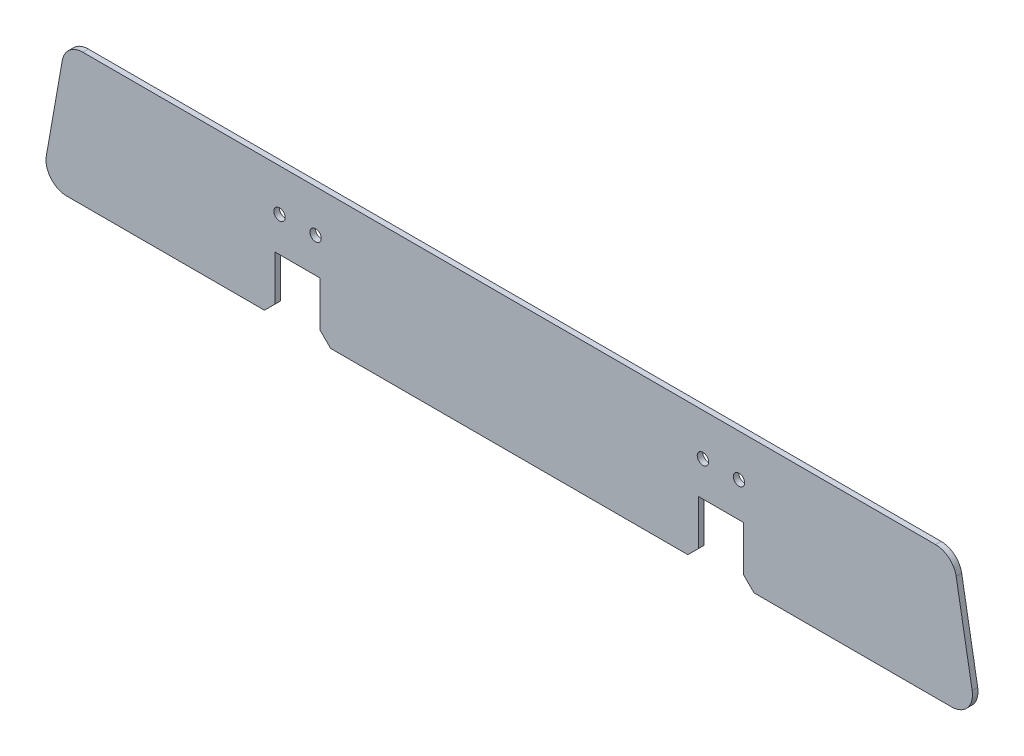
ISO-10303-21;
HEADER;
FILE_DESCRIPTION(('STEP AP214'),'2;1');
FILE_NAME('part.step','',(''),(''),'','','');
FILE_SCHEMA(('AUTOMOTIVE_DESIGN { 1 0 10303 214 1 1 1 1 }'));
ENDSEC;
DATA;
#1=APPLICATION_CONTEXT('core data for automotive mechanical design processes');
#2=APPLICATION_PROTOCOL_DEFINITION('international standard','automotive_design',2000,#1);
#3=PRODUCT_CONTEXT('',#1,'mechanical');
#4=PRODUCT('Part','Part','',(#3));
#5=PRODUCT_RELATED_PRODUCT_CATEGORY('part','',(#4));
#6=PRODUCT_DEFINITION_FORMATION('','',#4);
#7=PRODUCT_DEFINITION_CONTEXT('part definition',#1,'design');
#8=PRODUCT_DEFINITION('design','',#6,#7);
#9=PRODUCT_DEFINITION_SHAPE('','',#8);
#10=(LENGTH_UNIT() NAMED_UNIT(*) SI_UNIT(.MILLI.,.METRE.));
#11=(NAMED_UNIT(*) PLANE_ANGLE_UNIT() SI_UNIT($,.RADIAN.));
#12=(NAMED_UNIT(*) SI_UNIT($,.STERADIAN.) SOLID_ANGLE_UNIT());
#13=UNCERTAINTY_MEASURE_WITH_UNIT(LENGTH_MEASURE(1.E-05),#10,'distance_accuracy_value','');
#14=(GEOMETRIC_REPRESENTATION_CONTEXT(3) GLOBAL_UNCERTAINTY_ASSIGNED_CONTEXT((#13)) GLOBAL_UNIT_ASSIGNED_CONTEXT((#10,
#11,#12)) REPRESENTATION_CONTEXT('',''));
#15=CARTESIAN_POINT('',(0.,0.,0.));
#16=DIRECTION('',(0.,0.,1.));
#17=DIRECTION('',(1.,0.,0.));
#18=AXIS2_PLACEMENT_3D('',#15,#16,#17);
#19=CARTESIAN_POINT('',(-108.62,-38.1,3.175));
#20=DIRECTION('',(1.,0.,0.));
#21=DIRECTION('',(0.,1.,0.));
#22=AXIS2_PLACEMENT_3D('',#19,#20,#21);
#23=PLANE('',#22);
#24=DIRECTION('',(0.,1.,0.));
#25=VECTOR('',#24,1.);
#26=CARTESIAN_POINT('',(-108.62,0.,0.));
#27=LINE('',#26,#25);
#28=CARTESIAN_POINT('',(-108.62,-32.1000000000001,0.));
#29=VERTEX_POINT('',#28);
#30=CARTESIAN_POINT('',(-108.62,-6.10000000000003,0.));
#31=VERTEX_POINT('',#30);
#32=EDGE_CURVE('E276',#29,#31,#27,.T.);
#33=ORIENTED_EDGE('',*,*,#32,.F.);
#34=DIRECTION('',(0.,0.,-1.));
#35=VECTOR('',#34,1.);
#36=CARTESIAN_POINT('',(-108.62,-32.1000000000001,3.175));
#37=LINE('',#36,#35);
#38=CARTESIAN_POINT('',(-108.62,-32.1000000000001,3.175));
#39=VERTEX_POINT('',#38);
#40=EDGE_CURVE('E339',#29,#39,#37,.F.);
#41=ORIENTED_EDGE('',*,*,#40,.T.);
#42=DIRECTION('',(0.,1.,0.));
#43=VECTOR('',#42,1.);
#44=CARTESIAN_POINT('',(-108.62,-38.1,3.175));
#45=LINE('',#44,#43);
#46=CARTESIAN_POINT('',(-108.62,-6.10000000000003,3.175));
#47=VERTEX_POINT('',#46);
#48=EDGE_CURVE('E210',#39,#47,#45,.T.);
#49=ORIENTED_EDGE('',*,*,#48,.T.);
#50=DIRECTION('',(0.,0.,1.));
#51=VECTOR('',#50,1.);
#52=CARTESIAN_POINT('',(-108.62,-6.10000000000003,3.175));
#53=LINE('',#52,#51);
#54=EDGE_CURVE('E209',#31,#47,#53,.T.);
#55=ORIENTED_EDGE('',*,*,#54,.F.);
#56=EDGE_LOOP('',(#33,#41,#49,#55));
#57=FACE_BOUND('',#56,.T.);
#58=ADVANCED_FACE('F45',(#57),#23,.F.);
#59=CARTESIAN_POINT('',(255.,-38.1,3.175));
#60=DIRECTION('',(0.,-1.,0.));
#61=DIRECTION('',(1.,0.,0.));
#62=AXIS2_PLACEMENT_3D('',#59,#60,#61);
#63=PLANE('',#62);
#64=DIRECTION('',(1.,0.,0.));
#65=VECTOR('',#64,1.);
#66=CARTESIAN_POINT('',(255.,-38.1,3.175));
#67=LINE('',#66,#65);
#68=CARTESIAN_POINT('',(-102.62,-38.1,3.175));
#69=VERTEX_POINT('',#68);
#70=CARTESIAN_POINT('',(102.62,-38.1,3.175));
#71=VERTEX_POINT('',#70);
#72=EDGE_CURVE('E212',#69,#71,#67,.T.);
#73=ORIENTED_EDGE('',*,*,#72,.F.);
#74=DIRECTION('',(0.,0.,-1.));
#75=VECTOR('',#74,1.);
#76=CARTESIAN_POINT('',(-102.62,-38.1,3.175));
#77=LINE('',#76,#75);
#78=CARTESIAN_POINT('',(-102.62,-38.1,0.));
#79=VERTEX_POINT('',#78);
#80=EDGE_CURVE('E345',#69,#79,#77,.T.);
#81=ORIENTED_EDGE('',*,*,#80,.T.);
#82=DIRECTION('',(1.,0.,0.));
#83=VECTOR('',#82,1.);
#84=CARTESIAN_POINT('',(0.,-38.1,0.));
#85=LINE('',#84,#83);
#86=CARTESIAN_POINT('',(102.62,-38.1,0.));
#87=VERTEX_POINT('',#86);
#88=EDGE_CURVE('E274',#79,#87,#85,.T.);
#89=ORIENTED_EDGE('',*,*,#88,.T.);
#90=DIRECTION('',(0.,0.,1.));
#91=VECTOR('',#90,1.);
#92=CARTESIAN_POINT('',(102.62,-38.1,3.175));
#93=LINE('',#92,#91);
#94=EDGE_CURVE('E342',#87,#71,#93,.T.);
#95=ORIENTED_EDGE('',*,*,#94,.T.);
#96=EDGE_LOOP('',(#73,#81,#89,#95));
#97=FACE_BOUND('',#96,.T.);
#98=ADVANCED_FACE('F380',(#97),#63,.T.);
#99=CARTESIAN_POINT('',(108.62,-38.1,3.175));
#100=DIRECTION('',(-1.,0.,0.));
#101=DIRECTION('',(0.,-1.,0.));
#102=AXIS2_PLACEMENT_3D('',#99,#100,#101);
#103=PLANE('',#102);
#104=DIRECTION('',(0.,-1.,0.));
#105=VECTOR('',#104,1.);
#106=CARTESIAN_POINT('',(108.62,-38.1,3.175));
#107=LINE('',#106,#105);
#108=CARTESIAN_POINT('',(108.62,-6.10000000000003,3.175));
#109=VERTEX_POINT('',#108);
#110=CARTESIAN_POINT('',(108.62,-32.1,3.175));
#111=VERTEX_POINT('',#110);
#112=EDGE_CURVE('E218',#109,#111,#107,.T.);
#113=ORIENTED_EDGE('',*,*,#112,.T.);
#114=DIRECTION('',(0.,0.,1.));
#115=VECTOR('',#114,1.);
#116=CARTESIAN_POINT('',(108.62,-32.1,3.175));
#117=LINE('',#116,#115);
#118=CARTESIAN_POINT('',(108.62,-32.1,0.));
#119=VERTEX_POINT('',#118);
#120=EDGE_CURVE('E11',#111,#119,#117,.F.);
#121=ORIENTED_EDGE('',*,*,#120,.T.);
#122=DIRECTION('',(0.,1.,0.));
#123=VECTOR('',#122,1.);
#124=CARTESIAN_POINT('',(108.62,0.,0.));
#125=LINE('',#124,#123);
#126=CARTESIAN_POINT('',(108.62,-6.10000000000003,0.));
#127=VERTEX_POINT('',#126);
#128=EDGE_CURVE('E272',#127,#119,#125,.F.);
#129=ORIENTED_EDGE('',*,*,#128,.F.);
#130=DIRECTION('',(0.,0.,1.));
#131=VECTOR('',#130,1.);
#132=CARTESIAN_POINT('',(108.62,-6.10000000000003,3.175));
#133=LINE('',#132,#131);
#134=EDGE_CURVE('E281',#127,#109,#133,.T.);
#135=ORIENTED_EDGE('',*,*,#134,.T.);
#136=EDGE_LOOP('',(#113,#121,#129,#135));
#137=FACE_BOUND('',#136,.T.);
#138=ADVANCED_FACE('F374',(#137),#103,.F.);
#139=CARTESIAN_POINT('',(134.62,-6.10000000000002,3.175));
#140=DIRECTION('',(0.,1.,0.));
#141=DIRECTION('',(-1.,0.,0.));
#142=AXIS2_PLACEMENT_3D('',#139,#140,#141);
#143=PLANE('',#142);
#144=ORIENTED_EDGE('',*,*,#134,.F.);
#145=DIRECTION('',(1.,0.,0.));
#146=VECTOR('',#145,1.);
#147=CARTESIAN_POINT('',(0.,-6.10000000000002,0.));
#148=LINE('',#147,#146);
#149=CARTESIAN_POINT('',(134.62,-6.10000000000002,0.));
#150=VERTEX_POINT('',#149);
#151=EDGE_CURVE('E269',#150,#127,#148,.F.);
#152=ORIENTED_EDGE('',*,*,#151,.F.);
#153=DIRECTION('',(0.,0.,1.));
#154=VECTOR('',#153,1.);
#155=CARTESIAN_POINT('',(134.62,-6.10000000000002,3.175));
#156=LINE('',#155,#154);
#157=CARTESIAN_POINT('',(134.62,-6.10000000000002,3.175));
#158=VERTEX_POINT('',#157);
#159=EDGE_CURVE('E194',#150,#158,#156,.T.);
#160=ORIENTED_EDGE('',*,*,#159,.T.);
#161=DIRECTION('',(-1.,0.,0.));
#162=VECTOR('',#161,1.);
#163=CARTESIAN_POINT('',(134.62,-6.10000000000002,3.175));
#164=LINE('',#163,#162);
#165=EDGE_CURVE('E222',#158,#109,#164,.T.);
#166=ORIENTED_EDGE('',*,*,#165,.T.);
#167=EDGE_LOOP('',(#144,#152,#160,#166));
#168=FACE_BOUND('',#167,.T.);
#169=ADVANCED_FACE('F370',(#168),#143,.F.);
#170=CARTESIAN_POINT('',(134.62,-38.1,3.175));
#171=DIRECTION('',(1.,0.,0.));
#172=DIRECTION('',(0.,1.,0.));
#173=AXIS2_PLACEMENT_3D('',#170,#171,#172);
#174=PLANE('',#173);
#175=DIRECTION('',(0.,1.,0.));
#176=VECTOR('',#175,1.);
#177=CARTESIAN_POINT('',(134.62,0.,0.));
#178=LINE('',#177,#176);
#179=CARTESIAN_POINT('',(134.62,-32.1000000000001,0.));
#180=VERTEX_POINT('',#179);
#181=EDGE_CURVE('E267',#180,#150,#178,.T.);
#182=ORIENTED_EDGE('',*,*,#181,.F.);
#183=DIRECTION('',(0.,0.,-1.));
#184=VECTOR('',#183,1.);
#185=CARTESIAN_POINT('',(134.62,-32.1000000000001,3.175));
#186=LINE('',#185,#184);
#187=CARTESIAN_POINT('',(134.62,-32.1000000000001,3.175));
#188=VERTEX_POINT('',#187);
#189=EDGE_CURVE('E347',#180,#188,#186,.F.);
#190=ORIENTED_EDGE('',*,*,#189,.T.);
#191=DIRECTION('',(0.,1.,0.));
#192=VECTOR('',#191,1.);
#193=CARTESIAN_POINT('',(134.62,-38.1,3.175));
#194=LINE('',#193,#192);
#195=EDGE_CURVE('E225',#188,#158,#194,.T.);
#196=ORIENTED_EDGE('',*,*,#195,.T.);
#197=ORIENTED_EDGE('',*,*,#159,.F.);
#198=EDGE_LOOP('',(#182,#190,#196,#197));
#199=FACE_BOUND('',#198,.T.);
#200=ADVANCED_FACE('F365',(#199),#174,.F.);
#201=CARTESIAN_POINT('',(140.62,-38.1,3.175));
#202=VERTEX_POINT('',#201);
#203=CARTESIAN_POINT('',(254.135072818855,-38.1,3.175));
#204=VERTEX_POINT('',#203);
#205=EDGE_CURVE('E219',#202,#204,#67,.T.);
#206=ORIENTED_EDGE('',*,*,#205,.F.);
#207=DIRECTION('',(0.,0.,-1.));
#208=VECTOR('',#207,1.);
#209=CARTESIAN_POINT('',(140.62,-38.1,3.175));
#210=LINE('',#209,#208);
#211=CARTESIAN_POINT('',(140.62,-38.1,0.));
#212=VERTEX_POINT('',#211);
#213=EDGE_CURVE('E54',#202,#212,#210,.T.);
#214=ORIENTED_EDGE('',*,*,#213,.T.);
#215=DIRECTION('',(1.,0.,0.));
#216=VECTOR('',#215,1.);
#217=CARTESIAN_POINT('',(0.,-38.1,0.));
#218=LINE('',#217,#216);
#219=CARTESIAN_POINT('',(254.135072818855,-38.1,0.));
#220=VERTEX_POINT('',#219);
#221=EDGE_CURVE('E265',#212,#220,#218,.T.);
#222=ORIENTED_EDGE('',*,*,#221,.T.);
#223=DIRECTION('',(0.,0.,-1.));
#224=VECTOR('',#223,1.);
#225=CARTESIAN_POINT('',(254.135072818855,-38.1,3.175));
#226=LINE('',#225,#224);
#227=EDGE_CURVE('E283',#220,#204,#226,.F.);
#228=ORIENTED_EDGE('',*,*,#227,.T.);
#229=EDGE_LOOP('',(#206,#214,#222,#228));
#230=FACE_BOUND('',#229,.T.);
#231=ADVANCED_FACE('F353',(#230),#63,.T.);
#232=CARTESIAN_POINT('',(255.,38.1,3.175));
#233=DIRECTION('',(-0.984807753012208,-0.173648177666931,0.));
#234=DIRECTION('',(0.173648177666931,-0.984807753012208,0.));
#235=AXIS2_PLACEMENT_3D('',#232,#233,#234);
#236=PLANE('',#235);
#237=DIRECTION('',(0.173648177666931,-0.984807753012208,0.));
#238=VECTOR('',#237,1.);
#239=CARTESIAN_POINT('',(255.,38.1,3.175));
#240=LINE('',#239,#238);
#241=CARTESIAN_POINT('',(265.952765855001,-24.0162218679968,3.175));
#242=VERTEX_POINT('',#241);
#243=CARTESIAN_POINT('',(256.748497462019,28.1837781320032,3.175));
#244=VERTEX_POINT('',#243);
#245=EDGE_CURVE('E227',#242,#244,#240,.F.);
#246=ORIENTED_EDGE('',*,*,#245,.F.);
#247=DIRECTION('',(0.,0.,1.));
#248=VECTOR('',#247,1.);
#249=CARTESIAN_POINT('',(265.952765855001,-24.0162218679968,3.175));
#250=LINE('',#249,#248);
#251=CARTESIAN_POINT('',(265.952765855001,-24.0162218679968,0.));
#252=VERTEX_POINT('',#251);
#253=EDGE_CURVE('E298',#242,#252,#250,.F.);
#254=ORIENTED_EDGE('',*,*,#253,.T.);
#255=DIRECTION('',(0.173648177666931,-0.984807753012208,0.));
#256=VECTOR('',#255,1.);
#257=CARTESIAN_POINT('',(255.,38.1,0.));
#258=LINE('',#257,#256);
#259=CARTESIAN_POINT('',(256.748497462019,28.1837781320032,0.));
#260=VERTEX_POINT('',#259);
#261=EDGE_CURVE('E262',#252,#260,#258,.F.);
#262=ORIENTED_EDGE('',*,*,#261,.T.);
#263=DIRECTION('',(0.,0.,1.));
#264=VECTOR('',#263,1.);
#265=CARTESIAN_POINT('',(256.748497462019,28.1837781320032,3.175));
#266=LINE('',#265,#264);
#267=EDGE_CURVE('E295',#260,#244,#266,.T.);
#268=ORIENTED_EDGE('',*,*,#267,.T.);
#269=EDGE_LOOP('',(#246,#254,#262,#268));
#270=FACE_BOUND('',#269,.T.);
#271=ADVANCED_FACE('F401',(#270),#236,.F.);
#272=CARTESIAN_POINT('',(255.,38.1,3.175));
#273=DIRECTION('',(0.,1.,0.));
#274=DIRECTION('',(-1.,0.,0.));
#275=AXIS2_PLACEMENT_3D('',#272,#273,#274);
#276=PLANE('',#275);
#277=DIRECTION('',(-1.,0.,0.));
#278=VECTOR('',#277,1.);
#279=CARTESIAN_POINT('',(255.,38.1,3.175));
#280=LINE('',#279,#278);
#281=CARTESIAN_POINT('',(244.930804425873,38.1,3.175));
#282=VERTEX_POINT('',#281);
#283=CARTESIAN_POINT('',(-244.930804425873,38.1,3.175));
#284=VERTEX_POINT('',#283);
#285=EDGE_CURVE('E230',#282,#284,#280,.T.);
#286=ORIENTED_EDGE('',*,*,#285,.F.);
#287=DIRECTION('',(0.,0.,-1.));
#288=VECTOR('',#287,1.);
#289=CARTESIAN_POINT('',(244.930804425873,38.1,3.175));
#290=LINE('',#289,#288);
#291=CARTESIAN_POINT('',(244.930804425873,38.1,0.));
#292=VERTEX_POINT('',#291);
#293=EDGE_CURVE('E312',#282,#292,#290,.T.);
#294=ORIENTED_EDGE('',*,*,#293,.T.);
#295=DIRECTION('',(1.,0.,0.));
#296=VECTOR('',#295,1.);
#297=CARTESIAN_POINT('',(0.,38.1,0.));
#298=LINE('',#297,#296);
#299=CARTESIAN_POINT('',(-244.930804425873,38.1,0.));
#300=VERTEX_POINT('',#299);
#301=EDGE_CURVE('E258',#292,#300,#298,.F.);
#302=ORIENTED_EDGE('',*,*,#301,.T.);
#303=DIRECTION('',(0.,0.,-1.));
#304=VECTOR('',#303,1.);
#305=CARTESIAN_POINT('',(-244.930804425873,38.1,3.175));
#306=LINE('',#305,#304);
#307=EDGE_CURVE('E309',#300,#284,#306,.F.);
#308=ORIENTED_EDGE('',*,*,#307,.T.);
#309=EDGE_LOOP('',(#286,#294,#302,#308));
#310=FACE_BOUND('',#309,.T.);
#311=ADVANCED_FACE('F410',(#310),#276,.T.);
#312=CARTESIAN_POINT('',(-255.,38.1,3.175));
#313=DIRECTION('',(0.984807753012208,-0.173648177666931,0.));
#314=DIRECTION('',(0.173648177666931,0.984807753012208,0.));
#315=AXIS2_PLACEMENT_3D('',#312,#313,#314);
#316=PLANE('',#315);
#317=DIRECTION('',(0.173648177666931,0.984807753012208,0.));
#318=VECTOR('',#317,1.);
#319=CARTESIAN_POINT('',(-255.,38.1,3.175));
#320=LINE('',#319,#318);
#321=CARTESIAN_POINT('',(-256.748497462019,28.1837781320031,3.175));
#322=VERTEX_POINT('',#321);
#323=CARTESIAN_POINT('',(-265.952765855001,-24.0162218679969,3.175));
#324=VERTEX_POINT('',#323);
#325=EDGE_CURVE('E234',#322,#324,#320,.F.);
#326=ORIENTED_EDGE('',*,*,#325,.F.);
#327=DIRECTION('',(0.,0.,1.));
#328=VECTOR('',#327,1.);
#329=CARTESIAN_POINT('',(-256.748497462019,28.1837781320031,3.175));
#330=LINE('',#329,#328);
#331=CARTESIAN_POINT('',(-256.748497462019,28.1837781320031,0.));
#332=VERTEX_POINT('',#331);
#333=EDGE_CURVE('E317',#322,#332,#330,.F.);
#334=ORIENTED_EDGE('',*,*,#333,.T.);
#335=DIRECTION('',(0.173648177666931,0.984807753012208,0.));
#336=VECTOR('',#335,1.);
#337=CARTESIAN_POINT('',(-255.,38.1,0.));
#338=LINE('',#337,#336);
#339=CARTESIAN_POINT('',(-265.952765855001,-24.0162218679969,0.));
#340=VERTEX_POINT('',#339);
#341=EDGE_CURVE('E255',#332,#340,#338,.F.);
#342=ORIENTED_EDGE('',*,*,#341,.T.);
#343=DIRECTION('',(0.,0.,1.));
#344=VECTOR('',#343,1.);
#345=CARTESIAN_POINT('',(-265.952765855001,-24.0162218679969,3.175));
#346=LINE('',#345,#344);
#347=EDGE_CURVE('E314',#340,#324,#346,.T.);
#348=ORIENTED_EDGE('',*,*,#347,.T.);
#349=EDGE_LOOP('',(#326,#334,#342,#348));
#350=FACE_BOUND('',#349,.T.);
#351=ADVANCED_FACE('F418',(#350),#316,.F.);
#352=DIRECTION('',(1.,0.,0.));
#353=VECTOR('',#352,1.);
#354=CARTESIAN_POINT('',(0.,-38.1,0.));
#355=LINE('',#354,#353);
#356=CARTESIAN_POINT('',(-254.135072818855,-38.1,0.));
#357=VERTEX_POINT('',#356);
#358=CARTESIAN_POINT('',(-140.62,-38.1,0.));
#359=VERTEX_POINT('',#358);
#360=EDGE_CURVE('E251',#357,#359,#355,.T.);
#361=ORIENTED_EDGE('',*,*,#360,.T.);
#362=DIRECTION('',(0.,0.,1.));
#363=VECTOR('',#362,1.);
#364=CARTESIAN_POINT('',(-140.62,-38.1,3.175));
#365=LINE('',#364,#363);
#366=CARTESIAN_POINT('',(-140.62,-38.1,3.175));
#367=VERTEX_POINT('',#366);
#368=EDGE_CURVE('E321',#359,#367,#365,.T.);
#369=ORIENTED_EDGE('',*,*,#368,.T.);
#370=CARTESIAN_POINT('',(-254.135072818855,-38.1,3.175));
#371=VERTEX_POINT('',#370);
#372=EDGE_CURVE('E195',#371,#367,#67,.T.);
#373=ORIENTED_EDGE('',*,*,#372,.F.);
#374=DIRECTION('',(0.,0.,-1.));
#375=VECTOR('',#374,1.);
#376=CARTESIAN_POINT('',(-254.135072818855,-38.1,3.175));
#377=LINE('',#376,#375);
#378=EDGE_CURVE('E319',#371,#357,#377,.T.);
#379=ORIENTED_EDGE('',*,*,#378,.T.);
#380=EDGE_LOOP('',(#361,#369,#373,#379));
#381=FACE_BOUND('',#380,.T.);
#382=ADVANCED_FACE('F393',(#381),#63,.T.);
#383=CARTESIAN_POINT('',(-134.62,-38.1,3.175));
#384=DIRECTION('',(-1.,0.,0.));
#385=DIRECTION('',(0.,-1.,0.));
#386=AXIS2_PLACEMENT_3D('',#383,#384,#385);
#387=PLANE('',#386);
#388=DIRECTION('',(0.,-1.,0.));
#389=VECTOR('',#388,1.);
#390=CARTESIAN_POINT('',(-134.62,-38.1,3.175));
#391=LINE('',#390,#389);
#392=CARTESIAN_POINT('',(-134.62,-6.10000000000002,3.175));
#393=VERTEX_POINT('',#392);
#394=CARTESIAN_POINT('',(-134.62,-32.1,3.175));
#395=VERTEX_POINT('',#394);
#396=EDGE_CURVE('E186',#393,#395,#391,.T.);
#397=ORIENTED_EDGE('',*,*,#396,.T.);
#398=DIRECTION('',(0.,0.,1.));
#399=VECTOR('',#398,1.);
#400=CARTESIAN_POINT('',(-134.62,-32.1,3.175));
#401=LINE('',#400,#399);
#402=CARTESIAN_POINT('',(-134.62,-32.1,0.));
#403=VERTEX_POINT('',#402);
#404=EDGE_CURVE('E331',#395,#403,#401,.F.);
#405=ORIENTED_EDGE('',*,*,#404,.T.);
#406=DIRECTION('',(0.,1.,0.));
#407=VECTOR('',#406,1.);
#408=CARTESIAN_POINT('',(-134.62,0.,0.));
#409=LINE('',#408,#407);
#410=CARTESIAN_POINT('',(-134.62,-6.10000000000002,0.));
#411=VERTEX_POINT('',#410);
#412=EDGE_CURVE('E189',#411,#403,#409,.F.);
#413=ORIENTED_EDGE('',*,*,#412,.F.);
#414=DIRECTION('',(0.,0.,1.));
#415=VECTOR('',#414,1.);
#416=CARTESIAN_POINT('',(-134.62,-6.10000000000002,3.175));
#417=LINE('',#416,#415);
#418=EDGE_CURVE('E183',#411,#393,#417,.T.);
#419=ORIENTED_EDGE('',*,*,#418,.T.);
#420=EDGE_LOOP('',(#397,#405,#413,#419));
#421=FACE_BOUND('',#420,.T.);
#422=ADVANCED_FACE('F185',(#421),#387,.F.);
#423=CARTESIAN_POINT('',(-131.975,13.9,3.175));
#424=DIRECTION('',(0.,0.,1.));
#425=DIRECTION('',(1.,0.,0.));
#426=AXIS2_PLACEMENT_3D('',#423,#424,#425);
#427=CYLINDRICAL_SURFACE('',#426,3.26390000000001);
#428=CARTESIAN_POINT('',(-131.975,13.9,3.175));
#429=DIRECTION('',(0.,0.,1.));
#430=DIRECTION('',(1.,0.,0.));
#431=AXIS2_PLACEMENT_3D('',#428,#429,#430);
#432=CIRCLE('',#431,3.26390000000001);
#433=CARTESIAN_POINT('',(-128.7111,13.9,3.175));
#434=VERTEX_POINT('',#433);
#435=EDGE_CURVE('E254',#434,#434,#432,.T.);
#436=ORIENTED_EDGE('',*,*,#435,.T.);
#437=EDGE_LOOP('',(#436));
#438=FACE_BOUND('',#437,.T.);
#439=CARTESIAN_POINT('',(-131.975,13.9,0.));
#440=DIRECTION('',(0.,0.,1.));
#441=DIRECTION('',(1.,0.,0.));
#442=AXIS2_PLACEMENT_3D('',#439,#440,#441);
#443=CIRCLE('',#442,3.26390000000001);
#444=CARTESIAN_POINT('',(-128.7111,13.9,0.));
#445=VERTEX_POINT('',#444);
#446=EDGE_CURVE('E237',#445,#445,#443,.T.);
#447=ORIENTED_EDGE('',*,*,#446,.F.);
#448=EDGE_LOOP('',(#447));
#449=FACE_BOUND('',#448,.T.);
#450=ADVANCED_FACE('F525',(#438,#449),#427,.F.);
#451=CARTESIAN_POINT('',(-111.265,13.9,3.175));
#452=DIRECTION('',(0.,0.,1.));
#453=DIRECTION('',(1.,0.,0.));
#454=AXIS2_PLACEMENT_3D('',#451,#452,#453);
#455=CYLINDRICAL_SURFACE('',#454,3.2639);
#456=CARTESIAN_POINT('',(-111.265,13.9,3.175));
#457=DIRECTION('',(0.,0.,1.));
#458=DIRECTION('',(1.,0.,0.));
#459=AXIS2_PLACEMENT_3D('',#456,#457,#458);
#460=CIRCLE('',#459,3.2639);
#461=CARTESIAN_POINT('',(-108.0011,13.9,3.175));
#462=VERTEX_POINT('',#461);
#463=EDGE_CURVE('E742',#462,#462,#460,.T.);
#464=ORIENTED_EDGE('',*,*,#463,.T.);
#465=EDGE_LOOP('',(#464));
#466=FACE_BOUND('',#465,.T.);
#467=CARTESIAN_POINT('',(-111.265,13.9,0.));
#468=DIRECTION('',(0.,0.,1.));
#469=DIRECTION('',(1.,0.,0.));
#470=AXIS2_PLACEMENT_3D('',#467,#468,#469);
#471=CIRCLE('',#470,3.2639);
#472=CARTESIAN_POINT('',(-108.0011,13.9,0.));
#473=VERTEX_POINT('',#472);
#474=EDGE_CURVE('E240',#473,#473,#471,.T.);
#475=ORIENTED_EDGE('',*,*,#474,.F.);
#476=EDGE_LOOP('',(#475));
#477=FACE_BOUND('',#476,.T.);
#478=ADVANCED_FACE('F601',(#466,#477),#455,.F.);
#479=CARTESIAN_POINT('',(111.265,13.9,3.175));
#480=DIRECTION('',(0.,0.,1.));
#481=DIRECTION('',(1.,0.,0.));
#482=AXIS2_PLACEMENT_3D('',#479,#480,#481);
#483=CYLINDRICAL_SURFACE('',#482,3.2639);
#484=CARTESIAN_POINT('',(111.265,13.9,3.175));
#485=DIRECTION('',(0.,0.,1.));
#486=DIRECTION('',(1.,0.,0.));
#487=AXIS2_PLACEMENT_3D('',#484,#485,#486);
#488=CIRCLE('',#487,3.2639);
#489=CARTESIAN_POINT('',(114.5289,13.9,3.175));
#490=VERTEX_POINT('',#489);
#491=EDGE_CURVE('E745',#490,#490,#488,.T.);
#492=ORIENTED_EDGE('',*,*,#491,.T.);
#493=EDGE_LOOP('',(#492));
#494=FACE_BOUND('',#493,.T.);
#495=CARTESIAN_POINT('',(111.265,13.9,0.));
#496=DIRECTION('',(0.,0.,1.));
#497=DIRECTION('',(1.,0.,0.));
#498=AXIS2_PLACEMENT_3D('',#495,#496,#497);
#499=CIRCLE('',#498,3.2639);
#500=CARTESIAN_POINT('',(114.5289,13.9,0.));
#501=VERTEX_POINT('',#500);
#502=EDGE_CURVE('E243',#501,#501,#499,.T.);
#503=ORIENTED_EDGE('',*,*,#502,.F.);
#504=EDGE_LOOP('',(#503));
#505=FACE_BOUND('',#504,.T.);
#506=ADVANCED_FACE('F589',(#494,#505),#483,.F.);
#507=CARTESIAN_POINT('',(131.975,13.9,3.175));
#508=DIRECTION('',(0.,0.,1.));
#509=DIRECTION('',(1.,0.,0.));
#510=AXIS2_PLACEMENT_3D('',#507,#508,#509);
#511=CYLINDRICAL_SURFACE('',#510,3.26390000000001);
#512=CARTESIAN_POINT('',(131.975,13.9,3.175));
#513=DIRECTION('',(0.,0.,1.));
#514=DIRECTION('',(1.,0.,0.));
#515=AXIS2_PLACEMENT_3D('',#512,#513,#514);
#516=CIRCLE('',#515,3.26390000000001);
#517=CARTESIAN_POINT('',(135.2389,13.9,3.175));
#518=VERTEX_POINT('',#517);
#519=EDGE_CURVE('E204',#518,#518,#516,.T.);
#520=ORIENTED_EDGE('',*,*,#519,.T.);
#521=EDGE_LOOP('',(#520));
#522=FACE_BOUND('',#521,.T.);
#523=CARTESIAN_POINT('',(131.975,13.9,0.));
#524=DIRECTION('',(0.,0.,1.));
#525=DIRECTION('',(1.,0.,0.));
#526=AXIS2_PLACEMENT_3D('',#523,#524,#525);
#527=CIRCLE('',#526,3.26390000000001);
#528=CARTESIAN_POINT('',(135.2389,13.9,0.));
#529=VERTEX_POINT('',#528);
#530=EDGE_CURVE('E246',#529,#529,#527,.T.);
#531=ORIENTED_EDGE('',*,*,#530,.F.);
#532=EDGE_LOOP('',(#531));
#533=FACE_BOUND('',#532,.T.);
#534=ADVANCED_FACE('F443',(#522,#533),#511,.F.);
#535=CARTESIAN_POINT('',(-134.62,-6.10000000000002,3.175));
#536=DIRECTION('',(0.,1.,0.));
#537=DIRECTION('',(-1.,0.,0.));
#538=AXIS2_PLACEMENT_3D('',#535,#536,#537);
#539=PLANE('',#538);
#540=DIRECTION('',(1.,0.,0.));
#541=VECTOR('',#540,1.);
#542=CARTESIAN_POINT('',(0.,-6.10000000000003,0.));
#543=LINE('',#542,#541);
#544=EDGE_CURVE('E250',#31,#411,#543,.F.);
#545=ORIENTED_EDGE('',*,*,#544,.F.);
#546=ORIENTED_EDGE('',*,*,#54,.T.);
#547=DIRECTION('',(-1.,0.,0.));
#548=VECTOR('',#547,1.);
#549=CARTESIAN_POINT('',(-134.62,-6.10000000000002,3.175));
#550=LINE('',#549,#548);
#551=EDGE_CURVE('E202',#47,#393,#550,.T.);
#552=ORIENTED_EDGE('',*,*,#551,.T.);
#553=ORIENTED_EDGE('',*,*,#418,.F.);
#554=EDGE_LOOP('',(#545,#546,#552,#553));
#555=FACE_BOUND('',#554,.T.);
#556=ADVANCED_FACE('F207',(#555),#539,.F.);
#557=CARTESIAN_POINT('',(0.,0.,3.175));
#558=DIRECTION('',(0.,0.,1.));
#559=DIRECTION('',(1.,0.,0.));
#560=AXIS2_PLACEMENT_3D('',#557,#558,#559);
#561=PLANE('',#560);
#562=ORIENTED_EDGE('',*,*,#435,.F.);
#563=EDGE_LOOP('',(#562));
#564=FACE_BOUND('',#563,.T.);
#565=ORIENTED_EDGE('',*,*,#463,.F.);
#566=EDGE_LOOP('',(#565));
#567=FACE_BOUND('',#566,.T.);
#568=ORIENTED_EDGE('',*,*,#491,.F.);
#569=EDGE_LOOP('',(#568));
#570=FACE_BOUND('',#569,.T.);
#571=ORIENTED_EDGE('',*,*,#519,.F.);
#572=EDGE_LOOP('',(#571));
#573=FACE_BOUND('',#572,.T.);
#574=ORIENTED_EDGE('',*,*,#372,.T.);
#575=DIRECTION('',(0.707106781186548,0.707106781186548,0.));
#576=VECTOR('',#575,1.);
#577=CARTESIAN_POINT('',(-51.26,51.26,3.175));
#578=LINE('',#577,#576);
#579=EDGE_CURVE('E203',#367,#395,#578,.T.);
#580=ORIENTED_EDGE('',*,*,#579,.T.);
#581=ORIENTED_EDGE('',*,*,#396,.F.);
#582=ORIENTED_EDGE('',*,*,#551,.F.);
#583=ORIENTED_EDGE('',*,*,#48,.F.);
#584=DIRECTION('',(0.707106781186548,-0.707106781186547,0.));
#585=VECTOR('',#584,1.);
#586=CARTESIAN_POINT('',(-70.3599999999999,-70.3600000000001,3.175));
#587=LINE('',#586,#585);
#588=EDGE_CURVE('E328',#39,#69,#587,.T.);
#589=ORIENTED_EDGE('',*,*,#588,.T.);
#590=ORIENTED_EDGE('',*,*,#72,.T.);
#591=DIRECTION('',(0.707106781186548,0.707106781186547,0.));
#592=VECTOR('',#591,1.);
#593=CARTESIAN_POINT('',(70.3599999999999,-70.36,3.175));
#594=LINE('',#593,#592);
#595=EDGE_CURVE('E324',#71,#111,#594,.T.);
#596=ORIENTED_EDGE('',*,*,#595,.T.);
#597=ORIENTED_EDGE('',*,*,#112,.F.);
#598=ORIENTED_EDGE('',*,*,#165,.F.);
#599=ORIENTED_EDGE('',*,*,#195,.F.);
#600=DIRECTION('',(0.707106781186548,-0.707106781186548,0.));
#601=VECTOR('',#600,1.);
#602=CARTESIAN_POINT('',(51.26,51.26,3.175));
#603=LINE('',#602,#601);
#604=EDGE_CURVE('E326',#188,#202,#603,.T.);
#605=ORIENTED_EDGE('',*,*,#604,.T.);
#606=ORIENTED_EDGE('',*,*,#205,.T.);
#607=CARTESIAN_POINT('',(254.135072818855,-26.1,3.175));
#608=DIRECTION('',(0.,0.,1.));
#609=DIRECTION('',(1.,0.,0.));
#610=AXIS2_PLACEMENT_3D('',#607,#608,#609);
#611=CIRCLE('',#610,12.);
#612=EDGE_CURVE('E293',#204,#242,#611,.T.);
#613=ORIENTED_EDGE('',*,*,#612,.T.);
#614=ORIENTED_EDGE('',*,*,#245,.T.);
#615=CARTESIAN_POINT('',(244.930804425873,26.1,3.175));
#616=DIRECTION('',(0.,0.,1.));
#617=DIRECTION('',(1.,0.,0.));
#618=AXIS2_PLACEMENT_3D('',#615,#616,#617);
#619=CIRCLE('',#618,12.);
#620=EDGE_CURVE('E291',#244,#282,#619,.T.);
#621=ORIENTED_EDGE('',*,*,#620,.T.);
#622=ORIENTED_EDGE('',*,*,#285,.T.);
#623=CARTESIAN_POINT('',(-244.930804425873,26.1,3.175));
#624=DIRECTION('',(0.,0.,1.));
#625=DIRECTION('',(1.,0.,0.));
#626=AXIS2_PLACEMENT_3D('',#623,#624,#625);
#627=CIRCLE('',#626,12.);
#628=EDGE_CURVE('E289',#284,#322,#627,.T.);
#629=ORIENTED_EDGE('',*,*,#628,.T.);
#630=ORIENTED_EDGE('',*,*,#325,.T.);
#631=CARTESIAN_POINT('',(-254.135072818855,-26.1,3.175));
#632=DIRECTION('',(0.,0.,1.));
#633=DIRECTION('',(1.,0.,0.));
#634=AXIS2_PLACEMENT_3D('',#631,#632,#633);
#635=CIRCLE('',#634,12.);
#636=EDGE_CURVE('E287',#324,#371,#635,.T.);
#637=ORIENTED_EDGE('',*,*,#636,.T.);
#638=EDGE_LOOP('',(#574,#580,#581,#582,#583,#589,#590,#596,#597,#598,#599,#605,#606,#613,#614,
#621,#622,#629,#630,#637));
#639=FACE_BOUND('',#638,.T.);
#640=ADVANCED_FACE('F200',(#564,#567,#570,#573,#639),#561,.T.);
#641=CARTESIAN_POINT('',(0.,0.,0.));
#642=DIRECTION('',(0.,0.,1.));
#643=DIRECTION('',(1.,0.,0.));
#644=AXIS2_PLACEMENT_3D('',#641,#642,#643);
#645=PLANE('',#644);
#646=ORIENTED_EDGE('',*,*,#446,.T.);
#647=EDGE_LOOP('',(#646));
#648=FACE_BOUND('',#647,.T.);
#649=ORIENTED_EDGE('',*,*,#474,.T.);
#650=EDGE_LOOP('',(#649));
#651=FACE_BOUND('',#650,.T.);
#652=ORIENTED_EDGE('',*,*,#502,.T.);
#653=EDGE_LOOP('',(#652));
#654=FACE_BOUND('',#653,.T.);
#655=ORIENTED_EDGE('',*,*,#530,.T.);
#656=EDGE_LOOP('',(#655));
#657=FACE_BOUND('',#656,.T.);
#658=ORIENTED_EDGE('',*,*,#412,.T.);
#659=DIRECTION('',(-0.707106781186548,-0.707106781186548,0.));
#660=VECTOR('',#659,1.);
#661=CARTESIAN_POINT('',(-140.62,-38.1,0.));
#662=LINE('',#661,#660);
#663=EDGE_CURVE('E337',#403,#359,#662,.T.);
#664=ORIENTED_EDGE('',*,*,#663,.T.);
#665=ORIENTED_EDGE('',*,*,#360,.F.);
#666=CARTESIAN_POINT('',(-254.135072818855,-26.1,0.));
#667=DIRECTION('',(0.,0.,1.));
#668=DIRECTION('',(1.,0.,0.));
#669=AXIS2_PLACEMENT_3D('',#666,#667,#668);
#670=CIRCLE('',#669,12.);
#671=EDGE_CURVE('E300',#357,#340,#670,.F.);
#672=ORIENTED_EDGE('',*,*,#671,.T.);
#673=ORIENTED_EDGE('',*,*,#341,.F.);
#674=CARTESIAN_POINT('',(-244.930804425873,26.1,0.));
#675=DIRECTION('',(0.,0.,1.));
#676=DIRECTION('',(1.,0.,0.));
#677=AXIS2_PLACEMENT_3D('',#674,#675,#676);
#678=CIRCLE('',#677,12.);
#679=EDGE_CURVE('E302',#332,#300,#678,.F.);
#680=ORIENTED_EDGE('',*,*,#679,.T.);
#681=ORIENTED_EDGE('',*,*,#301,.F.);
#682=CARTESIAN_POINT('',(244.930804425873,26.1,0.));
#683=DIRECTION('',(0.,0.,1.));
#684=DIRECTION('',(1.,0.,0.));
#685=AXIS2_PLACEMENT_3D('',#682,#683,#684);
#686=CIRCLE('',#685,12.);
#687=EDGE_CURVE('E304',#292,#260,#686,.F.);
#688=ORIENTED_EDGE('',*,*,#687,.T.);
#689=ORIENTED_EDGE('',*,*,#261,.F.);
#690=CARTESIAN_POINT('',(254.135072818855,-26.1,0.));
#691=DIRECTION('',(0.,0.,1.));
#692=DIRECTION('',(1.,0.,0.));
#693=AXIS2_PLACEMENT_3D('',#690,#691,#692);
#694=CIRCLE('',#693,12.);
#695=EDGE_CURVE('E306',#252,#220,#694,.F.);
#696=ORIENTED_EDGE('',*,*,#695,.T.);
#697=ORIENTED_EDGE('',*,*,#221,.F.);
#698=DIRECTION('',(-0.707106781186548,0.707106781186548,0.));
#699=VECTOR('',#698,1.);
#700=CARTESIAN_POINT('',(134.62,-32.1000000000001,0.));
#701=LINE('',#700,#699);
#702=EDGE_CURVE('E334',#212,#180,#701,.T.);
#703=ORIENTED_EDGE('',*,*,#702,.T.);
#704=ORIENTED_EDGE('',*,*,#181,.T.);
#705=ORIENTED_EDGE('',*,*,#151,.T.);
#706=ORIENTED_EDGE('',*,*,#128,.T.);
#707=DIRECTION('',(-0.707106781186548,-0.707106781186547,0.));
#708=VECTOR('',#707,1.);
#709=CARTESIAN_POINT('',(102.62,-38.1,0.));
#710=LINE('',#709,#708);
#711=EDGE_CURVE('E67',#119,#87,#710,.T.);
#712=ORIENTED_EDGE('',*,*,#711,.T.);
#713=ORIENTED_EDGE('',*,*,#88,.F.);
#714=DIRECTION('',(-0.707106781186548,0.707106781186547,0.));
#715=VECTOR('',#714,1.);
#716=CARTESIAN_POINT('',(-108.62,-32.1000000000001,0.));
#717=LINE('',#716,#715);
#718=EDGE_CURVE('E61',#79,#29,#717,.T.);
#719=ORIENTED_EDGE('',*,*,#718,.T.);
#720=ORIENTED_EDGE('',*,*,#32,.T.);
#721=ORIENTED_EDGE('',*,*,#544,.T.);
#722=EDGE_LOOP('',(#658,#664,#665,#672,#673,#680,#681,#688,#689,#696,#697,#703,#704,#705,#706,
#712,#713,#719,#720,#721));
#723=FACE_BOUND('',#722,.T.);
#724=ADVANCED_FACE('F356',(#648,#651,#654,#657,#723),#645,.F.);
#725=CARTESIAN_POINT('',(254.135072818855,-26.1,3.175));
#726=DIRECTION('',(0.,0.,-1.));
#727=DIRECTION('',(-1.,0.,0.));
#728=AXIS2_PLACEMENT_3D('',#725,#726,#727);
#729=CYLINDRICAL_SURFACE('',#728,12.);
#730=ORIENTED_EDGE('',*,*,#695,.F.);
#731=ORIENTED_EDGE('',*,*,#253,.F.);
#732=ORIENTED_EDGE('',*,*,#612,.F.);
#733=ORIENTED_EDGE('',*,*,#227,.F.);
#734=EDGE_LOOP('',(#730,#731,#732,#733));
#735=FACE_BOUND('',#734,.T.);
#736=ADVANCED_FACE('F399',(#735),#729,.T.);
#737=CARTESIAN_POINT('',(244.930804425873,26.1,3.175));
#738=DIRECTION('',(0.,0.,-1.));
#739=DIRECTION('',(-1.,0.,0.));
#740=AXIS2_PLACEMENT_3D('',#737,#738,#739);
#741=CYLINDRICAL_SURFACE('',#740,12.);
#742=ORIENTED_EDGE('',*,*,#687,.F.);
#743=ORIENTED_EDGE('',*,*,#293,.F.);
#744=ORIENTED_EDGE('',*,*,#620,.F.);
#745=ORIENTED_EDGE('',*,*,#267,.F.);
#746=EDGE_LOOP('',(#742,#743,#744,#745));
#747=FACE_BOUND('',#746,.T.);
#748=ADVANCED_FACE('F407',(#747),#741,.T.);
#749=CARTESIAN_POINT('',(-244.930804425873,26.1,3.175));
#750=DIRECTION('',(0.,0.,-1.));
#751=DIRECTION('',(-1.,0.,0.));
#752=AXIS2_PLACEMENT_3D('',#749,#750,#751);
#753=CYLINDRICAL_SURFACE('',#752,12.);
#754=ORIENTED_EDGE('',*,*,#679,.F.);
#755=ORIENTED_EDGE('',*,*,#333,.F.);
#756=ORIENTED_EDGE('',*,*,#628,.F.);
#757=ORIENTED_EDGE('',*,*,#307,.F.);
#758=EDGE_LOOP('',(#754,#755,#756,#757));
#759=FACE_BOUND('',#758,.T.);
#760=ADVANCED_FACE('F414',(#759),#753,.T.);
#761=CARTESIAN_POINT('',(-254.135072818855,-26.1,3.175));
#762=DIRECTION('',(0.,0.,-1.));
#763=DIRECTION('',(-1.,0.,0.));
#764=AXIS2_PLACEMENT_3D('',#761,#762,#763);
#765=CYLINDRICAL_SURFACE('',#764,12.);
#766=ORIENTED_EDGE('',*,*,#671,.F.);
#767=ORIENTED_EDGE('',*,*,#378,.F.);
#768=ORIENTED_EDGE('',*,*,#636,.F.);
#769=ORIENTED_EDGE('',*,*,#347,.F.);
#770=EDGE_LOOP('',(#766,#767,#768,#769));
#771=FACE_BOUND('',#770,.T.);
#772=ADVANCED_FACE('F423',(#771),#765,.T.);
#773=CARTESIAN_POINT('',(-140.62,-38.1,3.175));
#774=DIRECTION('',(0.707106781186547,-0.707106781186547,0.));
#775=DIRECTION('',(0.,0.,-1.));
#776=AXIS2_PLACEMENT_3D('',#773,#774,#775);
#777=PLANE('',#776);
#778=ORIENTED_EDGE('',*,*,#663,.F.);
#779=ORIENTED_EDGE('',*,*,#404,.F.);
#780=ORIENTED_EDGE('',*,*,#579,.F.);
#781=ORIENTED_EDGE('',*,*,#368,.F.);
#782=EDGE_LOOP('',(#778,#779,#780,#781));
#783=FACE_BOUND('',#782,.T.);
#784=ADVANCED_FACE('F390',(#783),#777,.T.);
#785=CARTESIAN_POINT('',(-108.62,-32.1000000000001,3.175));
#786=DIRECTION('',(-0.707106781186547,-0.707106781186548,0.));
#787=DIRECTION('',(0.,0.,-1.));
#788=AXIS2_PLACEMENT_3D('',#785,#786,#787);
#789=PLANE('',#788);
#790=ORIENTED_EDGE('',*,*,#718,.F.);
#791=ORIENTED_EDGE('',*,*,#80,.F.);
#792=ORIENTED_EDGE('',*,*,#588,.F.);
#793=ORIENTED_EDGE('',*,*,#40,.F.);
#794=EDGE_LOOP('',(#790,#791,#792,#793));
#795=FACE_BOUND('',#794,.T.);
#796=ADVANCED_FACE('F384',(#795),#789,.T.);
#797=CARTESIAN_POINT('',(134.62,-32.1000000000001,3.175));
#798=DIRECTION('',(-0.707106781186548,-0.707106781186548,0.));
#799=DIRECTION('',(0.,0.,-1.));
#800=AXIS2_PLACEMENT_3D('',#797,#798,#799);
#801=PLANE('',#800);
#802=ORIENTED_EDGE('',*,*,#702,.F.);
#803=ORIENTED_EDGE('',*,*,#213,.F.);
#804=ORIENTED_EDGE('',*,*,#604,.F.);
#805=ORIENTED_EDGE('',*,*,#189,.F.);
#806=EDGE_LOOP('',(#802,#803,#804,#805));
#807=FACE_BOUND('',#806,.T.);
#808=ADVANCED_FACE('F362',(#807),#801,.T.);
#809=CARTESIAN_POINT('',(102.62,-38.1,3.175));
#810=DIRECTION('',(0.707106781186547,-0.707106781186548,0.));
#811=DIRECTION('',(0.,0.,-1.));
#812=AXIS2_PLACEMENT_3D('',#809,#810,#811);
#813=PLANE('',#812);
#814=ORIENTED_EDGE('',*,*,#711,.F.);
#815=ORIENTED_EDGE('',*,*,#120,.F.);
#816=ORIENTED_EDGE('',*,*,#595,.F.);
#817=ORIENTED_EDGE('',*,*,#94,.F.);
#818=EDGE_LOOP('',(#814,#815,#816,#817));
#819=FACE_BOUND('',#818,.T.);
#820=ADVANCED_FACE('F48',(#819),#813,.T.);
#821=CLOSED_SHELL('',(#58,#98,#138,#169,#200,#231,#271,#311,#351,#382,#422,#450,#478,#506,#534,
#556,#640,#724,#736,#748,#760,#772,#784,#796,#808,#820));
#822=MANIFOLD_SOLID_BREP('B2',#821);
#823=ADVANCED_BREP_SHAPE_REPRESENTATION('',(#18,#822),#14);
#824=SHAPE_DEFINITION_REPRESENTATION(#9,#823);
ENDSEC;
END-ISO-10303-21;
